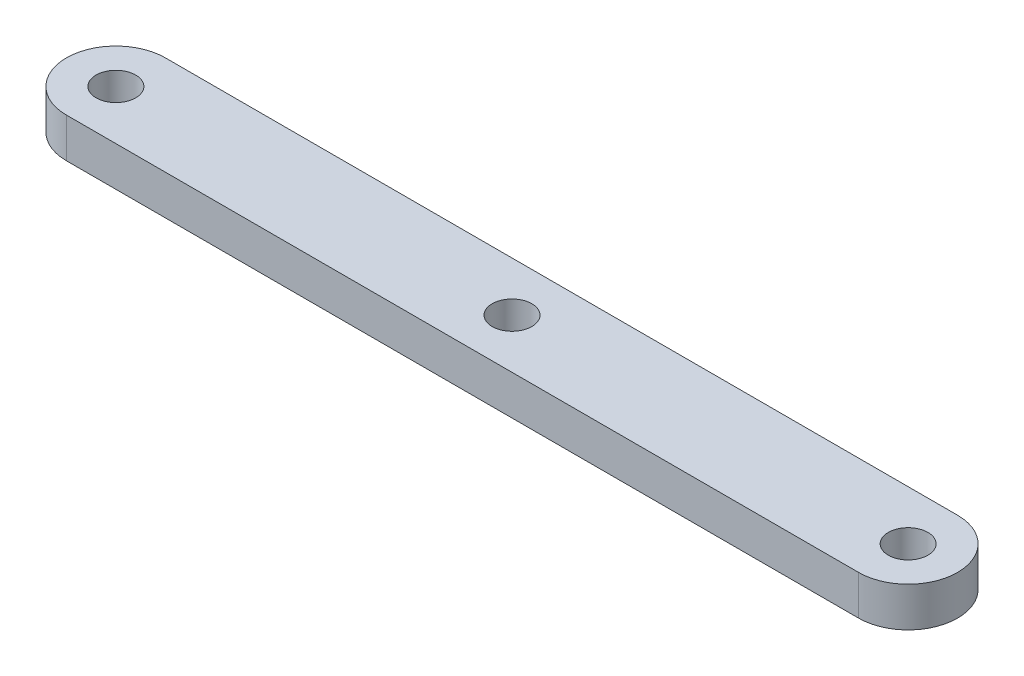
ISO-10303-21;
HEADER;
FILE_DESCRIPTION(('STEP AP214'),'2;1');
FILE_NAME('part.step','',(''),(''),'','','');
FILE_SCHEMA(('AUTOMOTIVE_DESIGN { 1 0 10303 214 1 1 1 1 }'));
ENDSEC;
DATA;
#1=APPLICATION_CONTEXT('core data for automotive mechanical design processes');
#2=APPLICATION_PROTOCOL_DEFINITION('international standard','automotive_design',2000,#1);
#3=PRODUCT_CONTEXT('',#1,'mechanical');
#4=PRODUCT('Part','Part','',(#3));
#5=PRODUCT_RELATED_PRODUCT_CATEGORY('part','',(#4));
#6=PRODUCT_DEFINITION_FORMATION('','',#4);
#7=PRODUCT_DEFINITION_CONTEXT('part definition',#1,'design');
#8=PRODUCT_DEFINITION('design','',#6,#7);
#9=PRODUCT_DEFINITION_SHAPE('','',#8);
#10=(LENGTH_UNIT() NAMED_UNIT(*) SI_UNIT(.MILLI.,.METRE.));
#11=(NAMED_UNIT(*) PLANE_ANGLE_UNIT() SI_UNIT($,.RADIAN.));
#12=(NAMED_UNIT(*) SI_UNIT($,.STERADIAN.) SOLID_ANGLE_UNIT());
#13=UNCERTAINTY_MEASURE_WITH_UNIT(LENGTH_MEASURE(1.E-05),#10,'distance_accuracy_value','');
#14=(GEOMETRIC_REPRESENTATION_CONTEXT(3) GLOBAL_UNCERTAINTY_ASSIGNED_CONTEXT((#13)) GLOBAL_UNIT_ASSIGNED_CONTEXT((#10,
#11,#12)) REPRESENTATION_CONTEXT('',''));
#15=CARTESIAN_POINT('',(0.,0.,0.));
#16=DIRECTION('',(0.,0.,1.));
#17=DIRECTION('',(1.,0.,0.));
#18=AXIS2_PLACEMENT_3D('',#15,#16,#17);
#19=CARTESIAN_POINT('',(-20.,2.,0.));
#20=DIRECTION('',(0.,1.,0.));
#21=DIRECTION('',(0.,0.,1.));
#22=AXIS2_PLACEMENT_3D('',#19,#20,#21);
#23=PLANE('',#22);
#24=CARTESIAN_POINT('',(-20.,2.,0.));
#25=DIRECTION('',(0.,1.,0.));
#26=DIRECTION('',(0.,0.,1.));
#27=AXIS2_PLACEMENT_3D('',#24,#25,#26);
#28=CIRCLE('',#27,1.);
#29=CARTESIAN_POINT('',(-20.,2.,1.));
#30=VERTEX_POINT('',#29);
#31=EDGE_CURVE('E119',#30,#30,#28,.T.);
#32=ORIENTED_EDGE('',*,*,#31,.F.);
#33=EDGE_LOOP('',(#32));
#34=FACE_BOUND('',#33,.T.);
#35=CARTESIAN_POINT('',(-20.,2.,0.));
#36=DIRECTION('',(0.,1.,0.));
#37=DIRECTION('',(0.,0.,1.));
#38=AXIS2_PLACEMENT_3D('',#35,#36,#37);
#39=CIRCLE('',#38,2.5);
#40=CARTESIAN_POINT('',(-20.,2.,-2.5));
#41=VERTEX_POINT('',#40);
#42=CARTESIAN_POINT('',(-20.,2.,2.5));
#43=VERTEX_POINT('',#42);
#44=EDGE_CURVE('E89',#41,#43,#39,.T.);
#45=ORIENTED_EDGE('',*,*,#44,.T.);
#46=DIRECTION('',(1.,0.,0.));
#47=VECTOR('',#46,1.);
#48=CARTESIAN_POINT('',(-20.,2.,2.5));
#49=LINE('',#48,#47);
#50=CARTESIAN_POINT('',(20.,2.,2.5));
#51=VERTEX_POINT('',#50);
#52=EDGE_CURVE('E84',#43,#51,#49,.T.);
#53=ORIENTED_EDGE('',*,*,#52,.T.);
#54=CARTESIAN_POINT('',(20.,2.,0.));
#55=DIRECTION('',(0.,1.,0.));
#56=DIRECTION('',(0.,0.,1.));
#57=AXIS2_PLACEMENT_3D('',#54,#55,#56);
#58=CIRCLE('',#57,2.5);
#59=CARTESIAN_POINT('',(20.,2.,-2.5));
#60=VERTEX_POINT('',#59);
#61=EDGE_CURVE('E87',#51,#60,#58,.T.);
#62=ORIENTED_EDGE('',*,*,#61,.T.);
#63=DIRECTION('',(-1.,0.,0.));
#64=VECTOR('',#63,1.);
#65=CARTESIAN_POINT('',(-20.,2.,-2.5));
#66=LINE('',#65,#64);
#67=EDGE_CURVE('E54',#60,#41,#66,.T.);
#68=ORIENTED_EDGE('',*,*,#67,.T.);
#69=EDGE_LOOP('',(#45,#53,#62,#68));
#70=FACE_BOUND('',#69,.T.);
#71=CARTESIAN_POINT('',(20.,2.,0.));
#72=DIRECTION('',(0.,1.,0.));
#73=DIRECTION('',(0.,0.,1.));
#74=AXIS2_PLACEMENT_3D('',#71,#72,#73);
#75=CIRCLE('',#74,1.);
#76=CARTESIAN_POINT('',(20.,2.,1.));
#77=VERTEX_POINT('',#76);
#78=EDGE_CURVE('E104',#77,#77,#75,.T.);
#79=ORIENTED_EDGE('',*,*,#78,.F.);
#80=EDGE_LOOP('',(#79));
#81=FACE_BOUND('',#80,.T.);
#82=CARTESIAN_POINT('',(0.,2.,0.));
#83=DIRECTION('',(0.,1.,0.));
#84=DIRECTION('',(0.,0.,1.));
#85=AXIS2_PLACEMENT_3D('',#82,#83,#84);
#86=CIRCLE('',#85,1.);
#87=CARTESIAN_POINT('',(0.,2.,1.));
#88=VERTEX_POINT('',#87);
#89=EDGE_CURVE('E125',#88,#88,#86,.T.);
#90=ORIENTED_EDGE('',*,*,#89,.F.);
#91=EDGE_LOOP('',(#90));
#92=FACE_BOUND('',#91,.T.);
#93=ADVANCED_FACE('F37',(#34,#70,#81,#92),#23,.T.);
#94=CARTESIAN_POINT('',(-20.,0.,0.));
#95=DIRECTION('',(0.,1.,0.));
#96=DIRECTION('',(0.,0.,1.));
#97=AXIS2_PLACEMENT_3D('',#94,#95,#96);
#98=PLANE('',#97);
#99=CARTESIAN_POINT('',(-20.,0.,0.));
#100=DIRECTION('',(0.,1.,0.));
#101=DIRECTION('',(0.,0.,1.));
#102=AXIS2_PLACEMENT_3D('',#99,#100,#101);
#103=CIRCLE('',#102,2.5);
#104=CARTESIAN_POINT('',(-20.,0.,-2.5));
#105=VERTEX_POINT('',#104);
#106=CARTESIAN_POINT('',(-20.,0.,2.5));
#107=VERTEX_POINT('',#106);
#108=EDGE_CURVE('E101',#105,#107,#103,.T.);
#109=ORIENTED_EDGE('',*,*,#108,.F.);
#110=DIRECTION('',(-1.,0.,0.));
#111=VECTOR('',#110,1.);
#112=CARTESIAN_POINT('',(-20.,0.,-2.5));
#113=LINE('',#112,#111);
#114=CARTESIAN_POINT('',(20.,0.,-2.5));
#115=VERTEX_POINT('',#114);
#116=EDGE_CURVE('E77',#115,#105,#113,.T.);
#117=ORIENTED_EDGE('',*,*,#116,.F.);
#118=CARTESIAN_POINT('',(20.,0.,0.));
#119=DIRECTION('',(0.,1.,0.));
#120=DIRECTION('',(0.,0.,1.));
#121=AXIS2_PLACEMENT_3D('',#118,#119,#120);
#122=CIRCLE('',#121,2.5);
#123=CARTESIAN_POINT('',(20.,0.,2.5));
#124=VERTEX_POINT('',#123);
#125=EDGE_CURVE('E71',#124,#115,#122,.T.);
#126=ORIENTED_EDGE('',*,*,#125,.F.);
#127=DIRECTION('',(1.,0.,0.));
#128=VECTOR('',#127,1.);
#129=CARTESIAN_POINT('',(-20.,0.,2.5));
#130=LINE('',#129,#128);
#131=EDGE_CURVE('E93',#107,#124,#130,.T.);
#132=ORIENTED_EDGE('',*,*,#131,.F.);
#133=EDGE_LOOP('',(#109,#117,#126,#132));
#134=FACE_BOUND('',#133,.T.);
#135=CARTESIAN_POINT('',(20.,0.,0.));
#136=DIRECTION('',(0.,1.,0.));
#137=DIRECTION('',(0.,0.,1.));
#138=AXIS2_PLACEMENT_3D('',#135,#136,#137);
#139=CIRCLE('',#138,1.);
#140=CARTESIAN_POINT('',(20.,0.,1.));
#141=VERTEX_POINT('',#140);
#142=EDGE_CURVE('E116',#141,#141,#139,.T.);
#143=ORIENTED_EDGE('',*,*,#142,.T.);
#144=EDGE_LOOP('',(#143));
#145=FACE_BOUND('',#144,.T.);
#146=CARTESIAN_POINT('',(-20.,0.,0.));
#147=DIRECTION('',(0.,1.,0.));
#148=DIRECTION('',(0.,0.,1.));
#149=AXIS2_PLACEMENT_3D('',#146,#147,#148);
#150=CIRCLE('',#149,1.);
#151=CARTESIAN_POINT('',(-20.,0.,1.));
#152=VERTEX_POINT('',#151);
#153=EDGE_CURVE('E122',#152,#152,#150,.T.);
#154=ORIENTED_EDGE('',*,*,#153,.T.);
#155=EDGE_LOOP('',(#154));
#156=FACE_BOUND('',#155,.T.);
#157=CARTESIAN_POINT('',(0.,0.,0.));
#158=DIRECTION('',(0.,1.,0.));
#159=DIRECTION('',(0.,0.,1.));
#160=AXIS2_PLACEMENT_3D('',#157,#158,#159);
#161=CIRCLE('',#160,1.);
#162=CARTESIAN_POINT('',(0.,0.,1.));
#163=VERTEX_POINT('',#162);
#164=EDGE_CURVE('E128',#163,#163,#161,.T.);
#165=ORIENTED_EDGE('',*,*,#164,.T.);
#166=EDGE_LOOP('',(#165));
#167=FACE_BOUND('',#166,.T.);
#168=ADVANCED_FACE('F112',(#134,#145,#156,#167),#98,.F.);
#169=CARTESIAN_POINT('',(-20.,2.,0.));
#170=DIRECTION('',(0.,-1.,0.));
#171=DIRECTION('',(0.,0.,-1.));
#172=AXIS2_PLACEMENT_3D('',#169,#170,#171);
#173=CYLINDRICAL_SURFACE('',#172,2.5);
#174=ORIENTED_EDGE('',*,*,#108,.T.);
#175=DIRECTION('',(0.,-1.,0.));
#176=VECTOR('',#175,1.);
#177=CARTESIAN_POINT('',(-20.,2.,2.5));
#178=LINE('',#177,#176);
#179=EDGE_CURVE('E11',#43,#107,#178,.T.);
#180=ORIENTED_EDGE('',*,*,#179,.F.);
#181=ORIENTED_EDGE('',*,*,#44,.F.);
#182=DIRECTION('',(0.,-1.,0.));
#183=VECTOR('',#182,1.);
#184=CARTESIAN_POINT('',(-20.,2.,-2.5));
#185=LINE('',#184,#183);
#186=EDGE_CURVE('E97',#41,#105,#185,.T.);
#187=ORIENTED_EDGE('',*,*,#186,.T.);
#188=EDGE_LOOP('',(#174,#180,#181,#187));
#189=FACE_BOUND('',#188,.T.);
#190=ADVANCED_FACE('F39',(#189),#173,.T.);
#191=CARTESIAN_POINT('',(-20.,2.,2.5));
#192=DIRECTION('',(0.,0.,-1.));
#193=DIRECTION('',(-1.,0.,0.));
#194=AXIS2_PLACEMENT_3D('',#191,#192,#193);
#195=PLANE('',#194);
#196=ORIENTED_EDGE('',*,*,#131,.T.);
#197=DIRECTION('',(0.,-1.,0.));
#198=VECTOR('',#197,1.);
#199=CARTESIAN_POINT('',(20.,2.,2.5));
#200=LINE('',#199,#198);
#201=EDGE_CURVE('E46',#51,#124,#200,.T.);
#202=ORIENTED_EDGE('',*,*,#201,.F.);
#203=ORIENTED_EDGE('',*,*,#52,.F.);
#204=ORIENTED_EDGE('',*,*,#179,.T.);
#205=EDGE_LOOP('',(#196,#202,#203,#204));
#206=FACE_BOUND('',#205,.T.);
#207=ADVANCED_FACE('F92',(#206),#195,.F.);
#208=CARTESIAN_POINT('',(20.,2.,0.));
#209=DIRECTION('',(0.,-1.,0.));
#210=DIRECTION('',(0.,0.,-1.));
#211=AXIS2_PLACEMENT_3D('',#208,#209,#210);
#212=CYLINDRICAL_SURFACE('',#211,2.5);
#213=ORIENTED_EDGE('',*,*,#125,.T.);
#214=DIRECTION('',(0.,-1.,0.));
#215=VECTOR('',#214,1.);
#216=CARTESIAN_POINT('',(20.,2.,-2.5));
#217=LINE('',#216,#215);
#218=EDGE_CURVE('E94',#60,#115,#217,.T.);
#219=ORIENTED_EDGE('',*,*,#218,.F.);
#220=ORIENTED_EDGE('',*,*,#61,.F.);
#221=ORIENTED_EDGE('',*,*,#201,.T.);
#222=EDGE_LOOP('',(#213,#219,#220,#221));
#223=FACE_BOUND('',#222,.T.);
#224=ADVANCED_FACE('F95',(#223),#212,.T.);
#225=CARTESIAN_POINT('',(-20.,2.,-2.5));
#226=DIRECTION('',(0.,0.,1.));
#227=DIRECTION('',(1.,0.,0.));
#228=AXIS2_PLACEMENT_3D('',#225,#226,#227);
#229=PLANE('',#228);
#230=ORIENTED_EDGE('',*,*,#116,.T.);
#231=ORIENTED_EDGE('',*,*,#186,.F.);
#232=ORIENTED_EDGE('',*,*,#67,.F.);
#233=ORIENTED_EDGE('',*,*,#218,.T.);
#234=EDGE_LOOP('',(#230,#231,#232,#233));
#235=FACE_BOUND('',#234,.T.);
#236=ADVANCED_FACE('F109',(#235),#229,.F.);
#237=CARTESIAN_POINT('',(20.,2.,0.));
#238=DIRECTION('',(0.,-1.,0.));
#239=DIRECTION('',(0.,0.,-1.));
#240=AXIS2_PLACEMENT_3D('',#237,#238,#239);
#241=CYLINDRICAL_SURFACE('',#240,1.);
#242=ORIENTED_EDGE('',*,*,#78,.T.);
#243=EDGE_LOOP('',(#242));
#244=FACE_BOUND('',#243,.T.);
#245=ORIENTED_EDGE('',*,*,#142,.F.);
#246=EDGE_LOOP('',(#245));
#247=FACE_BOUND('',#246,.T.);
#248=ADVANCED_FACE('F146',(#244,#247),#241,.F.);
#249=CARTESIAN_POINT('',(-20.,2.,0.));
#250=DIRECTION('',(0.,-1.,0.));
#251=DIRECTION('',(0.,0.,-1.));
#252=AXIS2_PLACEMENT_3D('',#249,#250,#251);
#253=CYLINDRICAL_SURFACE('',#252,1.);
#254=ORIENTED_EDGE('',*,*,#31,.T.);
#255=EDGE_LOOP('',(#254));
#256=FACE_BOUND('',#255,.T.);
#257=ORIENTED_EDGE('',*,*,#153,.F.);
#258=EDGE_LOOP('',(#257));
#259=FACE_BOUND('',#258,.T.);
#260=ADVANCED_FACE('F200',(#256,#259),#253,.F.);
#261=CARTESIAN_POINT('',(0.,2.,0.));
#262=DIRECTION('',(0.,-1.,0.));
#263=DIRECTION('',(0.,0.,-1.));
#264=AXIS2_PLACEMENT_3D('',#261,#262,#263);
#265=CYLINDRICAL_SURFACE('',#264,1.);
#266=ORIENTED_EDGE('',*,*,#89,.T.);
#267=EDGE_LOOP('',(#266));
#268=FACE_BOUND('',#267,.T.);
#269=ORIENTED_EDGE('',*,*,#164,.F.);
#270=EDGE_LOOP('',(#269));
#271=FACE_BOUND('',#270,.T.);
#272=ADVANCED_FACE('F134',(#268,#271),#265,.F.);
#273=CLOSED_SHELL('',(#93,#168,#190,#207,#224,#236,#248,#260,#272));
#274=MANIFOLD_SOLID_BREP('B2',#273);
#275=ADVANCED_BREP_SHAPE_REPRESENTATION('',(#18,#274),#14);
#276=SHAPE_DEFINITION_REPRESENTATION(#9,#275);
ENDSEC;
END-ISO-10303-21;
